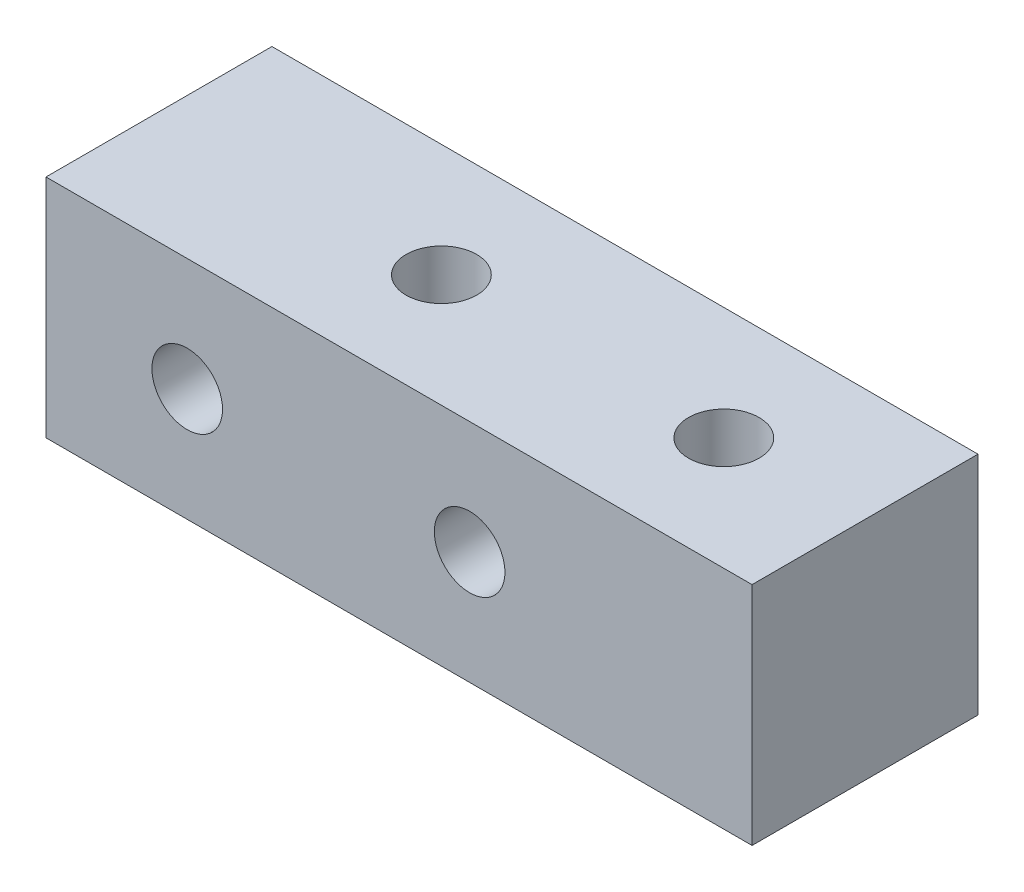
ISO-10303-21;
HEADER;
FILE_DESCRIPTION(('STEP AP214'),'2;1');
FILE_NAME('part.step','',(''),(''),'','','');
FILE_SCHEMA(('AUTOMOTIVE_DESIGN { 1 0 10303 214 1 1 1 1 }'));
ENDSEC;
DATA;
#1=APPLICATION_CONTEXT('core data for automotive mechanical design processes');
#2=APPLICATION_PROTOCOL_DEFINITION('international standard','automotive_design',2000,#1);
#3=PRODUCT_CONTEXT('',#1,'mechanical');
#4=PRODUCT('Part','Part','',(#3));
#5=PRODUCT_RELATED_PRODUCT_CATEGORY('part','',(#4));
#6=PRODUCT_DEFINITION_FORMATION('','',#4);
#7=PRODUCT_DEFINITION_CONTEXT('part definition',#1,'design');
#8=PRODUCT_DEFINITION('design','',#6,#7);
#9=PRODUCT_DEFINITION_SHAPE('','',#8);
#10=(LENGTH_UNIT() NAMED_UNIT(*) SI_UNIT(.MILLI.,.METRE.));
#11=(NAMED_UNIT(*) PLANE_ANGLE_UNIT() SI_UNIT($,.RADIAN.));
#12=(NAMED_UNIT(*) SI_UNIT($,.STERADIAN.) SOLID_ANGLE_UNIT());
#13=UNCERTAINTY_MEASURE_WITH_UNIT(LENGTH_MEASURE(1.E-05),#10,'distance_accuracy_value','');
#14=(GEOMETRIC_REPRESENTATION_CONTEXT(3) GLOBAL_UNCERTAINTY_ASSIGNED_CONTEXT((#13)) GLOBAL_UNIT_ASSIGNED_CONTEXT((#10,
#11,#12)) REPRESENTATION_CONTEXT('',''));
#15=CARTESIAN_POINT('',(0.,0.,0.));
#16=DIRECTION('',(0.,0.,1.));
#17=DIRECTION('',(1.,0.,0.));
#18=AXIS2_PLACEMENT_3D('',#15,#16,#17);
#19=CARTESIAN_POINT('',(12.5,8.,-4.));
#20=DIRECTION('',(-1.,0.,0.));
#21=DIRECTION('',(0.,0.,1.));
#22=AXIS2_PLACEMENT_3D('',#19,#20,#21);
#23=PLANE('',#22);
#24=DIRECTION('',(0.,0.,-1.));
#25=VECTOR('',#24,1.);
#26=CARTESIAN_POINT('',(12.5,0.,-4.));
#27=LINE('',#26,#25);
#28=CARTESIAN_POINT('',(12.5,0.,4.));
#29=VERTEX_POINT('',#28);
#30=CARTESIAN_POINT('',(12.5,0.,-4.));
#31=VERTEX_POINT('',#30);
#32=EDGE_CURVE('E106',#29,#31,#27,.T.);
#33=ORIENTED_EDGE('',*,*,#32,.T.);
#34=DIRECTION('',(0.,-1.,0.));
#35=VECTOR('',#34,1.);
#36=CARTESIAN_POINT('',(12.5,8.,-4.));
#37=LINE('',#36,#35);
#38=CARTESIAN_POINT('',(12.5,8.,-4.));
#39=VERTEX_POINT('',#38);
#40=EDGE_CURVE('E11',#39,#31,#37,.T.);
#41=ORIENTED_EDGE('',*,*,#40,.F.);
#42=DIRECTION('',(0.,0.,-1.));
#43=VECTOR('',#42,1.);
#44=CARTESIAN_POINT('',(12.5,8.,-4.));
#45=LINE('',#44,#43);
#46=CARTESIAN_POINT('',(12.5,8.,4.));
#47=VERTEX_POINT('',#46);
#48=EDGE_CURVE('E94',#47,#39,#45,.T.);
#49=ORIENTED_EDGE('',*,*,#48,.F.);
#50=DIRECTION('',(0.,-1.,0.));
#51=VECTOR('',#50,1.);
#52=CARTESIAN_POINT('',(12.5,8.,4.));
#53=LINE('',#52,#51);
#54=EDGE_CURVE('E105',#47,#29,#53,.T.);
#55=ORIENTED_EDGE('',*,*,#54,.T.);
#56=EDGE_LOOP('',(#33,#41,#49,#55));
#57=FACE_BOUND('',#56,.T.);
#58=ADVANCED_FACE('F43',(#57),#23,.F.);
#59=CARTESIAN_POINT('',(-12.5,8.,-4.));
#60=DIRECTION('',(0.,0.,1.));
#61=DIRECTION('',(1.,0.,0.));
#62=AXIS2_PLACEMENT_3D('',#59,#60,#61);
#63=PLANE('',#62);
#64=CARTESIAN_POINT('',(-7.5,4.,-4.));
#65=DIRECTION('',(0.,0.,1.));
#66=DIRECTION('',(1.,0.,0.));
#67=AXIS2_PLACEMENT_3D('',#64,#65,#66);
#68=CIRCLE('',#67,1.25);
#69=CARTESIAN_POINT('',(-6.25,4.,-4.));
#70=VERTEX_POINT('',#69);
#71=EDGE_CURVE('E124',#70,#70,#68,.T.);
#72=ORIENTED_EDGE('',*,*,#71,.T.);
#73=EDGE_LOOP('',(#72));
#74=FACE_BOUND('',#73,.T.);
#75=CARTESIAN_POINT('',(2.5,4.,-4.));
#76=DIRECTION('',(0.,0.,1.));
#77=DIRECTION('',(1.,0.,0.));
#78=AXIS2_PLACEMENT_3D('',#75,#76,#77);
#79=CIRCLE('',#78,1.25);
#80=CARTESIAN_POINT('',(3.75,4.,-4.));
#81=VERTEX_POINT('',#80);
#82=EDGE_CURVE('E108',#81,#81,#79,.T.);
#83=ORIENTED_EDGE('',*,*,#82,.T.);
#84=EDGE_LOOP('',(#83));
#85=FACE_BOUND('',#84,.T.);
#86=DIRECTION('',(-1.,0.,0.));
#87=VECTOR('',#86,1.);
#88=CARTESIAN_POINT('',(-12.5,0.,-4.));
#89=LINE('',#88,#87);
#90=CARTESIAN_POINT('',(-12.5,0.,-4.));
#91=VERTEX_POINT('',#90);
#92=EDGE_CURVE('E98',#31,#91,#89,.T.);
#93=ORIENTED_EDGE('',*,*,#92,.T.);
#94=DIRECTION('',(0.,-1.,0.));
#95=VECTOR('',#94,1.);
#96=CARTESIAN_POINT('',(-12.5,8.,-4.));
#97=LINE('',#96,#95);
#98=CARTESIAN_POINT('',(-12.5,8.,-4.));
#99=VERTEX_POINT('',#98);
#100=EDGE_CURVE('E51',#99,#91,#97,.T.);
#101=ORIENTED_EDGE('',*,*,#100,.F.);
#102=DIRECTION('',(-1.,0.,0.));
#103=VECTOR('',#102,1.);
#104=CARTESIAN_POINT('',(-12.5,8.,-4.));
#105=LINE('',#104,#103);
#106=EDGE_CURVE('E90',#39,#99,#105,.T.);
#107=ORIENTED_EDGE('',*,*,#106,.F.);
#108=ORIENTED_EDGE('',*,*,#40,.T.);
#109=EDGE_LOOP('',(#93,#101,#107,#108));
#110=FACE_BOUND('',#109,.T.);
#111=ADVANCED_FACE('F100',(#74,#85,#110),#63,.F.);
#112=CARTESIAN_POINT('',(-12.5,8.,-4.));
#113=DIRECTION('',(1.,0.,0.));
#114=DIRECTION('',(0.,0.,-1.));
#115=AXIS2_PLACEMENT_3D('',#112,#113,#114);
#116=PLANE('',#115);
#117=DIRECTION('',(0.,0.,1.));
#118=VECTOR('',#117,1.);
#119=CARTESIAN_POINT('',(-12.5,0.,-4.));
#120=LINE('',#119,#118);
#121=CARTESIAN_POINT('',(-12.5,0.,4.));
#122=VERTEX_POINT('',#121);
#123=EDGE_CURVE('E78',#91,#122,#120,.T.);
#124=ORIENTED_EDGE('',*,*,#123,.T.);
#125=DIRECTION('',(0.,-1.,0.));
#126=VECTOR('',#125,1.);
#127=CARTESIAN_POINT('',(-12.5,8.,4.));
#128=LINE('',#127,#126);
#129=CARTESIAN_POINT('',(-12.5,8.,4.));
#130=VERTEX_POINT('',#129);
#131=EDGE_CURVE('E97',#130,#122,#128,.T.);
#132=ORIENTED_EDGE('',*,*,#131,.F.);
#133=DIRECTION('',(0.,0.,1.));
#134=VECTOR('',#133,1.);
#135=CARTESIAN_POINT('',(-12.5,8.,-4.));
#136=LINE('',#135,#134);
#137=EDGE_CURVE('E95',#99,#130,#136,.T.);
#138=ORIENTED_EDGE('',*,*,#137,.F.);
#139=ORIENTED_EDGE('',*,*,#100,.T.);
#140=EDGE_LOOP('',(#124,#132,#138,#139));
#141=FACE_BOUND('',#140,.T.);
#142=ADVANCED_FACE('F99',(#141),#116,.F.);
#143=CARTESIAN_POINT('',(-12.5,8.,4.));
#144=DIRECTION('',(0.,0.,-1.));
#145=DIRECTION('',(-1.,0.,0.));
#146=AXIS2_PLACEMENT_3D('',#143,#144,#145);
#147=PLANE('',#146);
#148=CARTESIAN_POINT('',(-7.5,4.,4.));
#149=DIRECTION('',(0.,0.,1.));
#150=DIRECTION('',(1.,0.,0.));
#151=AXIS2_PLACEMENT_3D('',#148,#149,#150);
#152=CIRCLE('',#151,1.25);
#153=CARTESIAN_POINT('',(-6.25,4.,4.));
#154=VERTEX_POINT('',#153);
#155=EDGE_CURVE('E126',#154,#154,#152,.T.);
#156=ORIENTED_EDGE('',*,*,#155,.F.);
#157=EDGE_LOOP('',(#156));
#158=FACE_BOUND('',#157,.T.);
#159=CARTESIAN_POINT('',(2.5,4.,4.));
#160=DIRECTION('',(0.,0.,1.));
#161=DIRECTION('',(1.,0.,0.));
#162=AXIS2_PLACEMENT_3D('',#159,#160,#161);
#163=CIRCLE('',#162,1.25);
#164=CARTESIAN_POINT('',(3.75,4.,4.));
#165=VERTEX_POINT('',#164);
#166=EDGE_CURVE('E125',#165,#165,#163,.T.);
#167=ORIENTED_EDGE('',*,*,#166,.F.);
#168=EDGE_LOOP('',(#167));
#169=FACE_BOUND('',#168,.T.);
#170=DIRECTION('',(1.,0.,0.));
#171=VECTOR('',#170,1.);
#172=CARTESIAN_POINT('',(-12.5,0.,4.));
#173=LINE('',#172,#171);
#174=EDGE_CURVE('E85',#122,#29,#173,.T.);
#175=ORIENTED_EDGE('',*,*,#174,.T.);
#176=ORIENTED_EDGE('',*,*,#54,.F.);
#177=DIRECTION('',(1.,0.,0.));
#178=VECTOR('',#177,1.);
#179=CARTESIAN_POINT('',(-12.5,8.,4.));
#180=LINE('',#179,#178);
#181=EDGE_CURVE('E56',#130,#47,#180,.T.);
#182=ORIENTED_EDGE('',*,*,#181,.F.);
#183=ORIENTED_EDGE('',*,*,#131,.T.);
#184=EDGE_LOOP('',(#175,#176,#182,#183));
#185=FACE_BOUND('',#184,.T.);
#186=ADVANCED_FACE('F111',(#158,#169,#185),#147,.F.);
#187=CARTESIAN_POINT('',(0.,8.,0.));
#188=DIRECTION('',(0.,1.,0.));
#189=DIRECTION('',(0.,0.,1.));
#190=AXIS2_PLACEMENT_3D('',#187,#188,#189);
#191=PLANE('',#190);
#192=CARTESIAN_POINT('',(-2.5,8.,0.));
#193=DIRECTION('',(0.,1.,0.));
#194=DIRECTION('',(0.,0.,1.));
#195=AXIS2_PLACEMENT_3D('',#192,#193,#194);
#196=CIRCLE('',#195,1.24999999999999);
#197=CARTESIAN_POINT('',(-2.5,8.,1.24999999999999));
#198=VERTEX_POINT('',#197);
#199=EDGE_CURVE('E139',#198,#198,#196,.T.);
#200=ORIENTED_EDGE('',*,*,#199,.F.);
#201=EDGE_LOOP('',(#200));
#202=FACE_BOUND('',#201,.T.);
#203=CARTESIAN_POINT('',(7.5,8.,0.));
#204=DIRECTION('',(0.,1.,0.));
#205=DIRECTION('',(0.,0.,1.));
#206=AXIS2_PLACEMENT_3D('',#203,#204,#205);
#207=CIRCLE('',#206,1.24999999999999);
#208=CARTESIAN_POINT('',(7.5,8.,1.24999999999999));
#209=VERTEX_POINT('',#208);
#210=EDGE_CURVE('E135',#209,#209,#207,.T.);
#211=ORIENTED_EDGE('',*,*,#210,.F.);
#212=EDGE_LOOP('',(#211));
#213=FACE_BOUND('',#212,.T.);
#214=ORIENTED_EDGE('',*,*,#48,.T.);
#215=ORIENTED_EDGE('',*,*,#106,.T.);
#216=ORIENTED_EDGE('',*,*,#137,.T.);
#217=ORIENTED_EDGE('',*,*,#181,.T.);
#218=EDGE_LOOP('',(#214,#215,#216,#217));
#219=FACE_BOUND('',#218,.T.);
#220=ADVANCED_FACE('F89',(#202,#213,#219),#191,.T.);
#221=CARTESIAN_POINT('',(0.,0.,0.));
#222=DIRECTION('',(0.,1.,0.));
#223=DIRECTION('',(0.,0.,1.));
#224=AXIS2_PLACEMENT_3D('',#221,#222,#223);
#225=PLANE('',#224);
#226=CARTESIAN_POINT('',(-2.5,0.,0.));
#227=DIRECTION('',(0.,1.,0.));
#228=DIRECTION('',(0.,0.,1.));
#229=AXIS2_PLACEMENT_3D('',#226,#227,#228);
#230=CIRCLE('',#229,1.25);
#231=CARTESIAN_POINT('',(-2.5,0.,1.25));
#232=VERTEX_POINT('',#231);
#233=EDGE_CURVE('E140',#232,#232,#230,.T.);
#234=ORIENTED_EDGE('',*,*,#233,.T.);
#235=EDGE_LOOP('',(#234));
#236=FACE_BOUND('',#235,.T.);
#237=CARTESIAN_POINT('',(7.5,0.,0.));
#238=DIRECTION('',(0.,1.,0.));
#239=DIRECTION('',(0.,0.,1.));
#240=AXIS2_PLACEMENT_3D('',#237,#238,#239);
#241=CIRCLE('',#240,1.25);
#242=CARTESIAN_POINT('',(7.5,0.,1.25));
#243=VERTEX_POINT('',#242);
#244=EDGE_CURVE('E133',#243,#243,#241,.T.);
#245=ORIENTED_EDGE('',*,*,#244,.T.);
#246=EDGE_LOOP('',(#245));
#247=FACE_BOUND('',#246,.T.);
#248=ORIENTED_EDGE('',*,*,#32,.F.);
#249=ORIENTED_EDGE('',*,*,#174,.F.);
#250=ORIENTED_EDGE('',*,*,#123,.F.);
#251=ORIENTED_EDGE('',*,*,#92,.F.);
#252=EDGE_LOOP('',(#248,#249,#250,#251));
#253=FACE_BOUND('',#252,.T.);
#254=ADVANCED_FACE('F119',(#236,#247,#253),#225,.F.);
#255=CARTESIAN_POINT('',(2.5,4.,4.));
#256=DIRECTION('',(0.,0.,1.));
#257=DIRECTION('',(1.,0.,0.));
#258=AXIS2_PLACEMENT_3D('',#255,#256,#257);
#259=CYLINDRICAL_SURFACE('',#258,1.25);
#260=ORIENTED_EDGE('',*,*,#82,.F.);
#261=EDGE_LOOP('',(#260));
#262=FACE_BOUND('',#261,.T.);
#263=ORIENTED_EDGE('',*,*,#166,.T.);
#264=EDGE_LOOP('',(#263));
#265=FACE_BOUND('',#264,.T.);
#266=ADVANCED_FACE('F165',(#262,#265),#259,.F.);
#267=CARTESIAN_POINT('',(-7.5,4.,4.));
#268=DIRECTION('',(0.,0.,1.));
#269=DIRECTION('',(1.,0.,0.));
#270=AXIS2_PLACEMENT_3D('',#267,#268,#269);
#271=CYLINDRICAL_SURFACE('',#270,1.25);
#272=ORIENTED_EDGE('',*,*,#71,.F.);
#273=EDGE_LOOP('',(#272));
#274=FACE_BOUND('',#273,.T.);
#275=ORIENTED_EDGE('',*,*,#155,.T.);
#276=EDGE_LOOP('',(#275));
#277=FACE_BOUND('',#276,.T.);
#278=ADVANCED_FACE('F153',(#274,#277),#271,.F.);
#279=CARTESIAN_POINT('',(7.5,8.,0.));
#280=DIRECTION('',(0.,1.,0.));
#281=DIRECTION('',(0.,0.,1.));
#282=AXIS2_PLACEMENT_3D('',#279,#280,#281);
#283=CYLINDRICAL_SURFACE('',#282,1.24999999999999);
#284=ORIENTED_EDGE('',*,*,#244,.F.);
#285=EDGE_LOOP('',(#284));
#286=FACE_BOUND('',#285,.T.);
#287=ORIENTED_EDGE('',*,*,#210,.T.);
#288=EDGE_LOOP('',(#287));
#289=FACE_BOUND('',#288,.T.);
#290=ADVANCED_FACE('F151',(#286,#289),#283,.F.);
#291=CARTESIAN_POINT('',(-2.5,8.,0.));
#292=DIRECTION('',(0.,1.,0.));
#293=DIRECTION('',(0.,0.,1.));
#294=AXIS2_PLACEMENT_3D('',#291,#292,#293);
#295=CYLINDRICAL_SURFACE('',#294,1.24999999999999);
#296=ORIENTED_EDGE('',*,*,#233,.F.);
#297=EDGE_LOOP('',(#296));
#298=FACE_BOUND('',#297,.T.);
#299=ORIENTED_EDGE('',*,*,#199,.T.);
#300=EDGE_LOOP('',(#299));
#301=FACE_BOUND('',#300,.T.);
#302=ADVANCED_FACE('F145',(#298,#301),#295,.F.);
#303=CLOSED_SHELL('',(#58,#111,#142,#186,#220,#254,#266,#278,#290,#302));
#304=MANIFOLD_SOLID_BREP('B2',#303);
#305=ADVANCED_BREP_SHAPE_REPRESENTATION('',(#18,#304),#14);
#306=SHAPE_DEFINITION_REPRESENTATION(#9,#305);
ENDSEC;
END-ISO-10303-21;
